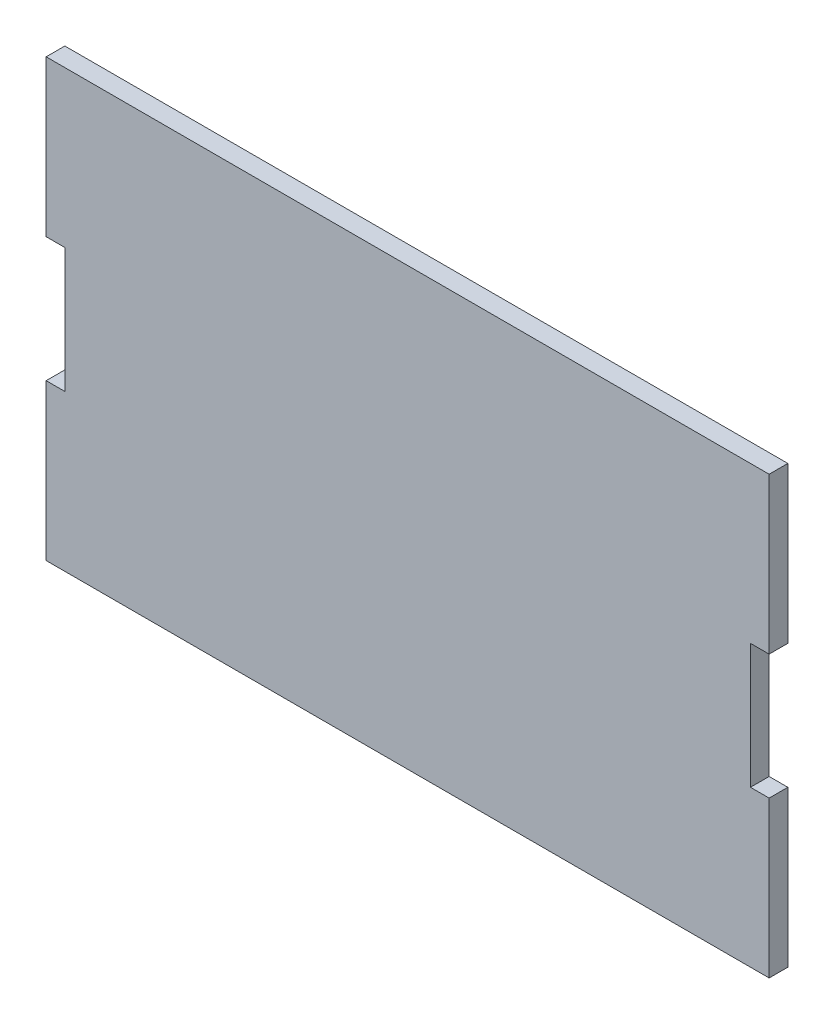
ISO-10303-21;
HEADER;
FILE_DESCRIPTION(('STEP AP214'),'2;1');
FILE_NAME('part.step','',(''),(''),'','','');
FILE_SCHEMA(('AUTOMOTIVE_DESIGN { 1 0 10303 214 1 1 1 1 }'));
ENDSEC;
DATA;
#1=APPLICATION_CONTEXT('core data for automotive mechanical design processes');
#2=APPLICATION_PROTOCOL_DEFINITION('international standard','automotive_design',2000,#1);
#3=PRODUCT_CONTEXT('',#1,'mechanical');
#4=PRODUCT('Part','Part','',(#3));
#5=PRODUCT_RELATED_PRODUCT_CATEGORY('part','',(#4));
#6=PRODUCT_DEFINITION_FORMATION('','',#4);
#7=PRODUCT_DEFINITION_CONTEXT('part definition',#1,'design');
#8=PRODUCT_DEFINITION('design','',#6,#7);
#9=PRODUCT_DEFINITION_SHAPE('','',#8);
#10=(LENGTH_UNIT() NAMED_UNIT(*) SI_UNIT(.MILLI.,.METRE.));
#11=(NAMED_UNIT(*) PLANE_ANGLE_UNIT() SI_UNIT($,.RADIAN.));
#12=(NAMED_UNIT(*) SI_UNIT($,.STERADIAN.) SOLID_ANGLE_UNIT());
#13=UNCERTAINTY_MEASURE_WITH_UNIT(LENGTH_MEASURE(1.E-05),#10,'distance_accuracy_value','');
#14=(GEOMETRIC_REPRESENTATION_CONTEXT(3) GLOBAL_UNCERTAINTY_ASSIGNED_CONTEXT((#13)) GLOBAL_UNIT_ASSIGNED_CONTEXT((#10,
#11,#12)) REPRESENTATION_CONTEXT('',''));
#15=CARTESIAN_POINT('',(0.,0.,0.));
#16=DIRECTION('',(0.,0.,1.));
#17=DIRECTION('',(1.,0.,0.));
#18=AXIS2_PLACEMENT_3D('',#15,#16,#17);
#19=CARTESIAN_POINT('',(-54.8687069422364,-35.,3.));
#20=DIRECTION('',(1.,0.,0.));
#21=DIRECTION('',(0.,0.,-1.));
#22=AXIS2_PLACEMENT_3D('',#19,#20,#21);
#23=PLANE('',#22);
#24=DIRECTION('',(0.,0.,1.));
#25=VECTOR('',#24,1.);
#26=CARTESIAN_POINT('',(-54.8687069422364,-10.,-7.));
#27=LINE('',#26,#25);
#28=CARTESIAN_POINT('',(-54.8687069422364,-10.,0.));
#29=VERTEX_POINT('',#28);
#30=CARTESIAN_POINT('',(-54.8687069422364,-10.,3.));
#31=VERTEX_POINT('',#30);
#32=EDGE_CURVE('E162',#29,#31,#27,.T.);
#33=ORIENTED_EDGE('',*,*,#32,.F.);
#34=DIRECTION('',(0.,-1.,0.));
#35=VECTOR('',#34,1.);
#36=CARTESIAN_POINT('',(-54.8687069422364,-35.,0.));
#37=LINE('',#36,#35);
#38=CARTESIAN_POINT('',(-54.8687069422364,-35.,0.));
#39=VERTEX_POINT('',#38);
#40=EDGE_CURVE('E178',#29,#39,#37,.T.);
#41=ORIENTED_EDGE('',*,*,#40,.T.);
#42=DIRECTION('',(0.,0.,-1.));
#43=VECTOR('',#42,1.);
#44=CARTESIAN_POINT('',(-54.8687069422364,-35.,3.));
#45=LINE('',#44,#43);
#46=CARTESIAN_POINT('',(-54.8687069422364,-35.,3.));
#47=VERTEX_POINT('',#46);
#48=EDGE_CURVE('E190',#47,#39,#45,.T.);
#49=ORIENTED_EDGE('',*,*,#48,.F.);
#50=DIRECTION('',(0.,-1.,0.));
#51=VECTOR('',#50,1.);
#52=CARTESIAN_POINT('',(-54.8687069422364,-35.,3.));
#53=LINE('',#52,#51);
#54=EDGE_CURVE('E170',#31,#47,#53,.T.);
#55=ORIENTED_EDGE('',*,*,#54,.F.);
#56=EDGE_LOOP('',(#33,#41,#49,#55));
#57=FACE_BOUND('',#56,.T.);
#58=ADVANCED_FACE('F33',(#57),#23,.F.);
#59=DIRECTION('',(0.,0.,1.));
#60=VECTOR('',#59,1.);
#61=CARTESIAN_POINT('',(-54.8687069422364,9.99999999999999,-7.));
#62=LINE('',#61,#60);
#63=CARTESIAN_POINT('',(-54.8687069422364,9.99999999999999,0.));
#64=VERTEX_POINT('',#63);
#65=CARTESIAN_POINT('',(-54.8687069422364,9.99999999999999,3.));
#66=VERTEX_POINT('',#65);
#67=EDGE_CURVE('E48',#64,#66,#62,.T.);
#68=ORIENTED_EDGE('',*,*,#67,.T.);
#69=CARTESIAN_POINT('',(-54.8687069422364,35.,3.));
#70=VERTEX_POINT('',#69);
#71=EDGE_CURVE('E171',#70,#66,#53,.T.);
#72=ORIENTED_EDGE('',*,*,#71,.F.);
#73=DIRECTION('',(0.,0.,-1.));
#74=VECTOR('',#73,1.);
#75=CARTESIAN_POINT('',(-54.8687069422364,35.,3.));
#76=LINE('',#75,#74);
#77=CARTESIAN_POINT('',(-54.8687069422364,35.,0.));
#78=VERTEX_POINT('',#77);
#79=EDGE_CURVE('E193',#70,#78,#76,.T.);
#80=ORIENTED_EDGE('',*,*,#79,.T.);
#81=EDGE_CURVE('E179',#78,#64,#37,.T.);
#82=ORIENTED_EDGE('',*,*,#81,.T.);
#83=EDGE_LOOP('',(#68,#72,#80,#82));
#84=FACE_BOUND('',#83,.T.);
#85=ADVANCED_FACE('F225',(#84),#23,.F.);
#86=CARTESIAN_POINT('',(61.1312930577636,0.,3.));
#87=DIRECTION('',(-1.,0.,0.));
#88=DIRECTION('',(0.,0.,1.));
#89=AXIS2_PLACEMENT_3D('',#86,#87,#88);
#90=PLANE('',#89);
#91=DIRECTION('',(0.,1.,0.));
#92=VECTOR('',#91,1.);
#93=CARTESIAN_POINT('',(61.1312930577636,35.,3.));
#94=LINE('',#93,#92);
#95=CARTESIAN_POINT('',(61.1312930577636,10.,3.));
#96=VERTEX_POINT('',#95);
#97=CARTESIAN_POINT('',(61.1312930577636,35.,3.));
#98=VERTEX_POINT('',#97);
#99=EDGE_CURVE('E168',#96,#98,#94,.T.);
#100=ORIENTED_EDGE('',*,*,#99,.F.);
#101=DIRECTION('',(0.,0.,1.));
#102=VECTOR('',#101,1.);
#103=CARTESIAN_POINT('',(61.1312930577636,10.,-7.));
#104=LINE('',#103,#102);
#105=CARTESIAN_POINT('',(61.1312930577636,10.,0.));
#106=VERTEX_POINT('',#105);
#107=EDGE_CURVE('E148',#106,#96,#104,.T.);
#108=ORIENTED_EDGE('',*,*,#107,.F.);
#109=DIRECTION('',(0.,1.,0.));
#110=VECTOR('',#109,1.);
#111=CARTESIAN_POINT('',(61.1312930577636,0.,0.));
#112=LINE('',#111,#110);
#113=CARTESIAN_POINT('',(61.1312930577636,35.,0.));
#114=VERTEX_POINT('',#113);
#115=EDGE_CURVE('E184',#106,#114,#112,.T.);
#116=ORIENTED_EDGE('',*,*,#115,.T.);
#117=DIRECTION('',(0.,0.,-1.));
#118=VECTOR('',#117,1.);
#119=CARTESIAN_POINT('',(61.1312930577636,35.,3.));
#120=LINE('',#119,#118);
#121=EDGE_CURVE('E196',#98,#114,#120,.T.);
#122=ORIENTED_EDGE('',*,*,#121,.F.);
#123=EDGE_LOOP('',(#100,#108,#116,#122));
#124=FACE_BOUND('',#123,.T.);
#125=ADVANCED_FACE('F219',(#124),#90,.F.);
#126=CARTESIAN_POINT('',(0.,0.,3.));
#127=DIRECTION('',(0.,0.,-1.));
#128=DIRECTION('',(-1.,0.,0.));
#129=AXIS2_PLACEMENT_3D('',#126,#127,#128);
#130=PLANE('',#129);
#131=DIRECTION('',(0.,-1.,0.));
#132=VECTOR('',#131,1.);
#133=CARTESIAN_POINT('',(58.1312930577636,0.,3.));
#134=LINE('',#133,#132);
#135=CARTESIAN_POINT('',(58.1312930577636,10.,3.));
#136=VERTEX_POINT('',#135);
#137=CARTESIAN_POINT('',(58.1312930577636,-10.,3.));
#138=VERTEX_POINT('',#137);
#139=EDGE_CURVE('E130',#136,#138,#134,.T.);
#140=ORIENTED_EDGE('',*,*,#139,.F.);
#141=DIRECTION('',(-1.,0.,0.));
#142=VECTOR('',#141,1.);
#143=CARTESIAN_POINT('',(0.,9.99999999999997,3.));
#144=LINE('',#143,#142);
#145=EDGE_CURVE('E127',#96,#136,#144,.T.);
#146=ORIENTED_EDGE('',*,*,#145,.F.);
#147=ORIENTED_EDGE('',*,*,#99,.T.);
#148=DIRECTION('',(-1.,0.,0.));
#149=VECTOR('',#148,1.);
#150=CARTESIAN_POINT('',(-54.8687069422364,35.,3.));
#151=LINE('',#150,#149);
#152=EDGE_CURVE('E167',#98,#70,#151,.T.);
#153=ORIENTED_EDGE('',*,*,#152,.T.);
#154=ORIENTED_EDGE('',*,*,#71,.T.);
#155=DIRECTION('',(1.,0.,0.));
#156=VECTOR('',#155,1.);
#157=CARTESIAN_POINT('',(0.,9.99999999999996,3.));
#158=LINE('',#157,#156);
#159=CARTESIAN_POINT('',(-51.8687069422364,9.99999999999999,3.));
#160=VERTEX_POINT('',#159);
#161=EDGE_CURVE('E154',#66,#160,#158,.T.);
#162=ORIENTED_EDGE('',*,*,#161,.T.);
#163=DIRECTION('',(0.,-1.,0.));
#164=VECTOR('',#163,1.);
#165=CARTESIAN_POINT('',(-51.8687069422364,0.,3.));
#166=LINE('',#165,#164);
#167=CARTESIAN_POINT('',(-51.8687069422364,-10.,3.));
#168=VERTEX_POINT('',#167);
#169=EDGE_CURVE('E151',#160,#168,#166,.T.);
#170=ORIENTED_EDGE('',*,*,#169,.T.);
#171=DIRECTION('',(-1.,0.,0.));
#172=VECTOR('',#171,1.);
#173=CARTESIAN_POINT('',(0.,-10.,3.));
#174=LINE('',#173,#172);
#175=EDGE_CURVE('E157',#168,#31,#174,.T.);
#176=ORIENTED_EDGE('',*,*,#175,.T.);
#177=ORIENTED_EDGE('',*,*,#54,.T.);
#178=DIRECTION('',(1.,0.,0.));
#179=VECTOR('',#178,1.);
#180=CARTESIAN_POINT('',(61.1312930577636,-35.,3.));
#181=LINE('',#180,#179);
#182=CARTESIAN_POINT('',(61.1312930577636,-35.,3.));
#183=VERTEX_POINT('',#182);
#184=EDGE_CURVE('E174',#47,#183,#181,.T.);
#185=ORIENTED_EDGE('',*,*,#184,.T.);
#186=CARTESIAN_POINT('',(61.1312930577636,-10.,3.));
#187=VERTEX_POINT('',#186);
#188=EDGE_CURVE('E142',#183,#187,#94,.T.);
#189=ORIENTED_EDGE('',*,*,#188,.T.);
#190=DIRECTION('',(1.,0.,0.));
#191=VECTOR('',#190,1.);
#192=CARTESIAN_POINT('',(0.,-10.,3.));
#193=LINE('',#192,#191);
#194=EDGE_CURVE('E123',#138,#187,#193,.T.);
#195=ORIENTED_EDGE('',*,*,#194,.F.);
#196=EDGE_LOOP('',(#140,#146,#147,#153,#154,#162,#170,#176,#177,#185,#189,#195));
#197=FACE_BOUND('',#196,.T.);
#198=ADVANCED_FACE('F140',(#197),#130,.F.);
#199=CARTESIAN_POINT('',(0.,0.,0.));
#200=DIRECTION('',(0.,0.,-1.));
#201=DIRECTION('',(-1.,0.,0.));
#202=AXIS2_PLACEMENT_3D('',#199,#200,#201);
#203=PLANE('',#202);
#204=DIRECTION('',(1.,0.,0.));
#205=VECTOR('',#204,1.);
#206=CARTESIAN_POINT('',(0.,9.99999999999997,0.));
#207=LINE('',#206,#205);
#208=CARTESIAN_POINT('',(58.1312930577636,10.,0.));
#209=VERTEX_POINT('',#208);
#210=EDGE_CURVE('E11',#209,#106,#207,.T.);
#211=ORIENTED_EDGE('',*,*,#210,.F.);
#212=DIRECTION('',(0.,1.,0.));
#213=VECTOR('',#212,1.);
#214=CARTESIAN_POINT('',(58.1312930577636,0.,0.));
#215=LINE('',#214,#213);
#216=CARTESIAN_POINT('',(58.1312930577636,-10.,0.));
#217=VERTEX_POINT('',#216);
#218=EDGE_CURVE('E41',#217,#209,#215,.T.);
#219=ORIENTED_EDGE('',*,*,#218,.F.);
#220=DIRECTION('',(-1.,0.,0.));
#221=VECTOR('',#220,1.);
#222=CARTESIAN_POINT('',(0.,-10.,0.));
#223=LINE('',#222,#221);
#224=CARTESIAN_POINT('',(61.1312930577636,-10.,0.));
#225=VERTEX_POINT('',#224);
#226=EDGE_CURVE('E124',#225,#217,#223,.T.);
#227=ORIENTED_EDGE('',*,*,#226,.F.);
#228=CARTESIAN_POINT('',(61.1312930577636,-35.,0.));
#229=VERTEX_POINT('',#228);
#230=EDGE_CURVE('E185',#229,#225,#112,.T.);
#231=ORIENTED_EDGE('',*,*,#230,.F.);
#232=DIRECTION('',(1.,0.,0.));
#233=VECTOR('',#232,1.);
#234=CARTESIAN_POINT('',(61.1312930577636,-35.,0.));
#235=LINE('',#234,#233);
#236=EDGE_CURVE('E182',#39,#229,#235,.T.);
#237=ORIENTED_EDGE('',*,*,#236,.F.);
#238=ORIENTED_EDGE('',*,*,#40,.F.);
#239=DIRECTION('',(1.,0.,0.));
#240=VECTOR('',#239,1.);
#241=CARTESIAN_POINT('',(0.,-10.,0.));
#242=LINE('',#241,#240);
#243=CARTESIAN_POINT('',(-51.8687069422364,-10.,0.));
#244=VERTEX_POINT('',#243);
#245=EDGE_CURVE('E204',#29,#244,#242,.T.);
#246=ORIENTED_EDGE('',*,*,#245,.T.);
#247=DIRECTION('',(0.,1.,0.));
#248=VECTOR('',#247,1.);
#249=CARTESIAN_POINT('',(-51.8687069422364,0.,0.));
#250=LINE('',#249,#248);
#251=CARTESIAN_POINT('',(-51.8687069422364,9.99999999999999,0.));
#252=VERTEX_POINT('',#251);
#253=EDGE_CURVE('E201',#244,#252,#250,.T.);
#254=ORIENTED_EDGE('',*,*,#253,.T.);
#255=DIRECTION('',(-1.,0.,0.));
#256=VECTOR('',#255,1.);
#257=CARTESIAN_POINT('',(0.,9.99999999999996,0.));
#258=LINE('',#257,#256);
#259=EDGE_CURVE('E199',#252,#64,#258,.T.);
#260=ORIENTED_EDGE('',*,*,#259,.T.);
#261=ORIENTED_EDGE('',*,*,#81,.F.);
#262=DIRECTION('',(-1.,0.,0.));
#263=VECTOR('',#262,1.);
#264=CARTESIAN_POINT('',(-54.8687069422364,35.,0.));
#265=LINE('',#264,#263);
#266=EDGE_CURVE('E147',#114,#78,#265,.T.);
#267=ORIENTED_EDGE('',*,*,#266,.F.);
#268=ORIENTED_EDGE('',*,*,#115,.F.);
#269=EDGE_LOOP('',(#211,#219,#227,#231,#237,#238,#246,#254,#260,#261,#267,#268));
#270=FACE_BOUND('',#269,.T.);
#271=ADVANCED_FACE('F213',(#270),#203,.T.);
#272=CARTESIAN_POINT('',(-54.8687069422364,35.,3.));
#273=DIRECTION('',(0.,-1.,0.));
#274=DIRECTION('',(0.,0.,-1.));
#275=AXIS2_PLACEMENT_3D('',#272,#273,#274);
#276=PLANE('',#275);
#277=ORIENTED_EDGE('',*,*,#266,.T.);
#278=ORIENTED_EDGE('',*,*,#79,.F.);
#279=ORIENTED_EDGE('',*,*,#152,.F.);
#280=ORIENTED_EDGE('',*,*,#121,.T.);
#281=EDGE_LOOP('',(#277,#278,#279,#280));
#282=FACE_BOUND('',#281,.T.);
#283=ADVANCED_FACE('F35',(#282),#276,.F.);
#284=CARTESIAN_POINT('',(61.1312930577636,-35.,3.));
#285=DIRECTION('',(0.,1.,0.));
#286=DIRECTION('',(-1.,0.,0.));
#287=AXIS2_PLACEMENT_3D('',#284,#285,#286);
#288=PLANE('',#287);
#289=ORIENTED_EDGE('',*,*,#236,.T.);
#290=DIRECTION('',(0.,0.,-1.));
#291=VECTOR('',#290,1.);
#292=CARTESIAN_POINT('',(61.1312930577636,-35.,3.));
#293=LINE('',#292,#291);
#294=EDGE_CURVE('E176',#183,#229,#293,.T.);
#295=ORIENTED_EDGE('',*,*,#294,.F.);
#296=ORIENTED_EDGE('',*,*,#184,.F.);
#297=ORIENTED_EDGE('',*,*,#48,.T.);
#298=EDGE_LOOP('',(#289,#295,#296,#297));
#299=FACE_BOUND('',#298,.T.);
#300=ADVANCED_FACE('F244',(#299),#288,.F.);
#301=ORIENTED_EDGE('',*,*,#230,.T.);
#302=DIRECTION('',(0.,0.,1.));
#303=VECTOR('',#302,1.);
#304=CARTESIAN_POINT('',(61.1312930577636,-10.,-7.));
#305=LINE('',#304,#303);
#306=EDGE_CURVE('E56',#225,#187,#305,.T.);
#307=ORIENTED_EDGE('',*,*,#306,.T.);
#308=ORIENTED_EDGE('',*,*,#188,.F.);
#309=ORIENTED_EDGE('',*,*,#294,.T.);
#310=EDGE_LOOP('',(#301,#307,#308,#309));
#311=FACE_BOUND('',#310,.T.);
#312=ADVANCED_FACE('F247',(#311),#90,.F.);
#313=CARTESIAN_POINT('',(-51.8687069422364,0.,-7.));
#314=DIRECTION('',(-1.,0.,0.));
#315=DIRECTION('',(0.,-1.,0.));
#316=AXIS2_PLACEMENT_3D('',#313,#314,#315);
#317=PLANE('',#316);
#318=DIRECTION('',(0.,0.,1.));
#319=VECTOR('',#318,1.);
#320=CARTESIAN_POINT('',(-51.8687069422364,-10.,-7.));
#321=LINE('',#320,#319);
#322=EDGE_CURVE('E137',#244,#168,#321,.T.);
#323=ORIENTED_EDGE('',*,*,#322,.T.);
#324=ORIENTED_EDGE('',*,*,#169,.F.);
#325=DIRECTION('',(0.,0.,1.));
#326=VECTOR('',#325,1.);
#327=CARTESIAN_POINT('',(-51.8687069422364,9.99999999999999,-7.));
#328=LINE('',#327,#326);
#329=EDGE_CURVE('E160',#252,#160,#328,.T.);
#330=ORIENTED_EDGE('',*,*,#329,.F.);
#331=ORIENTED_EDGE('',*,*,#253,.F.);
#332=EDGE_LOOP('',(#323,#324,#330,#331));
#333=FACE_BOUND('',#332,.T.);
#334=ADVANCED_FACE('F230',(#333),#317,.T.);
#335=CARTESIAN_POINT('',(0.,-10.,-7.));
#336=DIRECTION('',(0.,1.,0.));
#337=DIRECTION('',(0.,0.,1.));
#338=AXIS2_PLACEMENT_3D('',#335,#336,#337);
#339=PLANE('',#338);
#340=ORIENTED_EDGE('',*,*,#32,.T.);
#341=ORIENTED_EDGE('',*,*,#175,.F.);
#342=ORIENTED_EDGE('',*,*,#322,.F.);
#343=ORIENTED_EDGE('',*,*,#245,.F.);
#344=EDGE_LOOP('',(#340,#341,#342,#343));
#345=FACE_BOUND('',#344,.T.);
#346=ADVANCED_FACE('F234',(#345),#339,.T.);
#347=CARTESIAN_POINT('',(0.,9.99999999999996,-7.));
#348=DIRECTION('',(0.,-1.,0.));
#349=DIRECTION('',(1.,0.,0.));
#350=AXIS2_PLACEMENT_3D('',#347,#348,#349);
#351=PLANE('',#350);
#352=ORIENTED_EDGE('',*,*,#329,.T.);
#353=ORIENTED_EDGE('',*,*,#161,.F.);
#354=ORIENTED_EDGE('',*,*,#67,.F.);
#355=ORIENTED_EDGE('',*,*,#259,.F.);
#356=EDGE_LOOP('',(#352,#353,#354,#355));
#357=FACE_BOUND('',#356,.T.);
#358=ADVANCED_FACE('F227',(#357),#351,.T.);
#359=CARTESIAN_POINT('',(58.1312930577636,0.,-7.));
#360=DIRECTION('',(-1.,0.,0.));
#361=DIRECTION('',(0.,0.,1.));
#362=AXIS2_PLACEMENT_3D('',#359,#360,#361);
#363=PLANE('',#362);
#364=ORIENTED_EDGE('',*,*,#218,.T.);
#365=DIRECTION('',(0.,0.,1.));
#366=VECTOR('',#365,1.);
#367=CARTESIAN_POINT('',(58.1312930577636,10.,-7.));
#368=LINE('',#367,#366);
#369=EDGE_CURVE('E133',#209,#136,#368,.T.);
#370=ORIENTED_EDGE('',*,*,#369,.T.);
#371=ORIENTED_EDGE('',*,*,#139,.T.);
#372=DIRECTION('',(0.,0.,1.));
#373=VECTOR('',#372,1.);
#374=CARTESIAN_POINT('',(58.1312930577636,-10.,-7.));
#375=LINE('',#374,#373);
#376=EDGE_CURVE('E119',#217,#138,#375,.T.);
#377=ORIENTED_EDGE('',*,*,#376,.F.);
#378=EDGE_LOOP('',(#364,#370,#371,#377));
#379=FACE_BOUND('',#378,.T.);
#380=ADVANCED_FACE('F131',(#379),#363,.F.);
#381=CARTESIAN_POINT('',(0.,9.99999999999997,-7.));
#382=DIRECTION('',(0.,1.,0.));
#383=DIRECTION('',(-1.,0.,0.));
#384=AXIS2_PLACEMENT_3D('',#381,#382,#383);
#385=PLANE('',#384);
#386=ORIENTED_EDGE('',*,*,#210,.T.);
#387=ORIENTED_EDGE('',*,*,#107,.T.);
#388=ORIENTED_EDGE('',*,*,#145,.T.);
#389=ORIENTED_EDGE('',*,*,#369,.F.);
#390=EDGE_LOOP('',(#386,#387,#388,#389));
#391=FACE_BOUND('',#390,.T.);
#392=ADVANCED_FACE('F210',(#391),#385,.F.);
#393=CARTESIAN_POINT('',(0.,-10.,-7.));
#394=DIRECTION('',(0.,-1.,0.));
#395=DIRECTION('',(0.,0.,-1.));
#396=AXIS2_PLACEMENT_3D('',#393,#394,#395);
#397=PLANE('',#396);
#398=ORIENTED_EDGE('',*,*,#226,.T.);
#399=ORIENTED_EDGE('',*,*,#376,.T.);
#400=ORIENTED_EDGE('',*,*,#194,.T.);
#401=ORIENTED_EDGE('',*,*,#306,.F.);
#402=EDGE_LOOP('',(#398,#399,#400,#401));
#403=FACE_BOUND('',#402,.T.);
#404=ADVANCED_FACE('F121',(#403),#397,.F.);
#405=CLOSED_SHELL('',(#58,#85,#125,#198,#271,#283,#300,#312,#334,#346,#358,#380,#392,#404));
#406=MANIFOLD_SOLID_BREP('B2',#405);
#407=ADVANCED_BREP_SHAPE_REPRESENTATION('',(#18,#406),#14);
#408=SHAPE_DEFINITION_REPRESENTATION(#9,#407);
ENDSEC;
END-ISO-10303-21;
